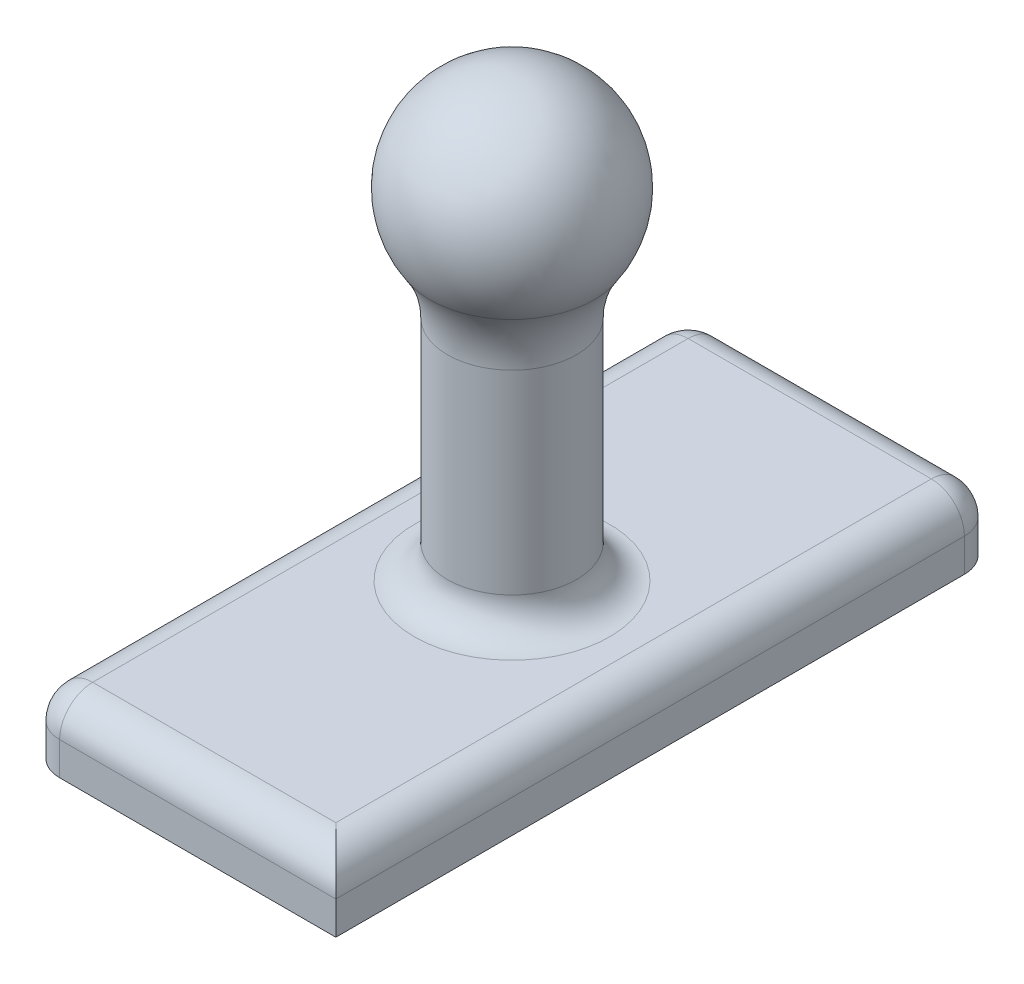
ISO-10303-21;
HEADER;
FILE_DESCRIPTION(('STEP AP214'),'2;1');
FILE_NAME('part.step','',(''),(''),'','','');
FILE_SCHEMA(('AUTOMOTIVE_DESIGN { 1 0 10303 214 1 1 1 1 }'));
ENDSEC;
DATA;
#1=APPLICATION_CONTEXT('core data for automotive mechanical design processes');
#2=APPLICATION_PROTOCOL_DEFINITION('international standard','automotive_design',2000,#1);
#3=PRODUCT_CONTEXT('',#1,'mechanical');
#4=PRODUCT('Part','Part','',(#3));
#5=PRODUCT_RELATED_PRODUCT_CATEGORY('part','',(#4));
#6=PRODUCT_DEFINITION_FORMATION('','',#4);
#7=PRODUCT_DEFINITION_CONTEXT('part definition',#1,'design');
#8=PRODUCT_DEFINITION('design','',#6,#7);
#9=PRODUCT_DEFINITION_SHAPE('','',#8);
#10=(LENGTH_UNIT() NAMED_UNIT(*) SI_UNIT(.MILLI.,.METRE.));
#11=(NAMED_UNIT(*) PLANE_ANGLE_UNIT() SI_UNIT($,.RADIAN.));
#12=(NAMED_UNIT(*) SI_UNIT($,.STERADIAN.) SOLID_ANGLE_UNIT());
#13=UNCERTAINTY_MEASURE_WITH_UNIT(LENGTH_MEASURE(1.E-05),#10,'distance_accuracy_value','');
#14=(GEOMETRIC_REPRESENTATION_CONTEXT(3) GLOBAL_UNCERTAINTY_ASSIGNED_CONTEXT((#13)) GLOBAL_UNIT_ASSIGNED_CONTEXT((#10,
#11,#12)) REPRESENTATION_CONTEXT('',''));
#15=CARTESIAN_POINT('',(0.,0.,0.));
#16=DIRECTION('',(0.,0.,1.));
#17=DIRECTION('',(1.,0.,0.));
#18=AXIS2_PLACEMENT_3D('',#15,#16,#17);
#19=CARTESIAN_POINT('',(0.,8.,0.));
#20=DIRECTION('',(0.,-1.,0.));
#21=DIRECTION('',(0.,0.,-1.));
#22=AXIS2_PLACEMENT_3D('',#19,#20,#21);
#23=CYLINDRICAL_SURFACE('',#22,1.95);
#24=CARTESIAN_POINT('',(0.,6.88505968506724,0.));
#25=DIRECTION('',(0.,1.,0.));
#26=DIRECTION('',(0.,0.,1.));
#27=AXIS2_PLACEMENT_3D('',#24,#25,#26);
#28=CIRCLE('',#27,1.95);
#29=CARTESIAN_POINT('',(0.,6.88505968506724,1.95));
#30=VERTEX_POINT('',#29);
#31=EDGE_CURVE('E11',#30,#30,#28,.F.);
#32=ORIENTED_EDGE('',*,*,#31,.T.);
#33=EDGE_LOOP('',(#32));
#34=FACE_BOUND('',#33,.T.);
#35=CARTESIAN_POINT('',(0.,1.,0.));
#36=DIRECTION('',(0.,1.,0.));
#37=DIRECTION('',(0.,0.,1.));
#38=AXIS2_PLACEMENT_3D('',#35,#36,#37);
#39=CIRCLE('',#38,1.95);
#40=CARTESIAN_POINT('',(0.,1.,1.95));
#41=VERTEX_POINT('',#40);
#42=EDGE_CURVE('E162',#41,#41,#39,.T.);
#43=ORIENTED_EDGE('',*,*,#42,.T.);
#44=EDGE_LOOP('',(#43));
#45=FACE_BOUND('',#44,.T.);
#46=ADVANCED_FACE('F43',(#34,#45),#23,.T.);
#47=CARTESIAN_POINT('',(0.,10.2912735849057,0.));
#48=DIRECTION('',(0.,0.,1.));
#49=DIRECTION('',(1.,0.,0.));
#50=AXIS2_PLACEMENT_3D('',#47,#48,#49);
#51=SPHERICAL_SURFACE('',#50,3.00872641509434);
#52=CARTESIAN_POINT('',(0.,10.2912735849057,0.));
#53=DIRECTION('',(0.,1.,0.));
#54=DIRECTION('',(0.,0.,1.));
#55=AXIS2_PLACEMENT_3D('',#52,#53,#54);
#56=SPHERICAL_SURFACE('',#55,3.00872641509434);
#57=CARTESIAN_POINT('',(0.,8.58569322928142,0.));
#58=DIRECTION('',(0.,1.,0.));
#59=DIRECTION('',(0.,0.,1.));
#60=AXIS2_PLACEMENT_3D('',#57,#58,#59);
#61=CIRCLE('',#60,2.47859441849511);
#62=CARTESIAN_POINT('',(0.,8.58569322928142,2.47859441849511));
#63=VERTEX_POINT('',#62);
#64=EDGE_CURVE('E51',#63,#63,#61,.T.);
#65=ORIENTED_EDGE('',*,*,#64,.T.);
#66=EDGE_LOOP('',(#65));
#67=FACE_BOUND('',#66,.T.);
#68=ADVANCED_FACE('F206',(#67),#56,.T.);
#69=CARTESIAN_POINT('',(-4.675,-2.,-10.));
#70=DIRECTION('',(-1.,0.,0.));
#71=DIRECTION('',(0.,0.,1.));
#72=AXIS2_PLACEMENT_3D('',#69,#70,#71);
#73=PLANE('',#72);
#74=DIRECTION('',(0.,0.,1.));
#75=VECTOR('',#74,1.);
#76=CARTESIAN_POINT('',(-4.675,-2.,-10.));
#77=LINE('',#76,#75);
#78=CARTESIAN_POINT('',(-4.675,-2.,-9.));
#79=VERTEX_POINT('',#78);
#80=CARTESIAN_POINT('',(-4.675,-2.,9.));
#81=VERTEX_POINT('',#80);
#82=EDGE_CURVE('E135',#79,#81,#77,.T.);
#83=ORIENTED_EDGE('',*,*,#82,.T.);
#84=DIRECTION('',(0.,1.,0.));
#85=VECTOR('',#84,1.);
#86=CARTESIAN_POINT('',(-4.675,-2.,9.));
#87=LINE('',#86,#85);
#88=CARTESIAN_POINT('',(-4.675,-1.,9.));
#89=VERTEX_POINT('',#88);
#90=EDGE_CURVE('E187',#81,#89,#87,.T.);
#91=ORIENTED_EDGE('',*,*,#90,.T.);
#92=DIRECTION('',(0.,0.,1.));
#93=VECTOR('',#92,1.);
#94=CARTESIAN_POINT('',(-4.675,-1.,-10.));
#95=LINE('',#94,#93);
#96=CARTESIAN_POINT('',(-4.675,-1.,-9.));
#97=VERTEX_POINT('',#96);
#98=EDGE_CURVE('E156',#89,#97,#95,.F.);
#99=ORIENTED_EDGE('',*,*,#98,.T.);
#100=DIRECTION('',(0.,1.,0.));
#101=VECTOR('',#100,1.);
#102=CARTESIAN_POINT('',(-4.675,-2.,-9.));
#103=LINE('',#102,#101);
#104=EDGE_CURVE('E183',#97,#79,#103,.F.);
#105=ORIENTED_EDGE('',*,*,#104,.T.);
#106=EDGE_LOOP('',(#83,#91,#99,#105));
#107=FACE_BOUND('',#106,.T.);
#108=ADVANCED_FACE('F228',(#107),#73,.T.);
#109=CARTESIAN_POINT('',(-4.675,-2.,-10.));
#110=DIRECTION('',(0.,0.,1.));
#111=DIRECTION('',(1.,0.,0.));
#112=AXIS2_PLACEMENT_3D('',#109,#110,#111);
#113=PLANE('',#112);
#114=DIRECTION('',(1.,0.,0.));
#115=VECTOR('',#114,1.);
#116=CARTESIAN_POINT('',(4.675,-1.,-10.));
#117=LINE('',#116,#115);
#118=CARTESIAN_POINT('',(-3.675,-1.,-10.));
#119=VERTEX_POINT('',#118);
#120=CARTESIAN_POINT('',(3.675,-1.,-10.));
#121=VERTEX_POINT('',#120);
#122=EDGE_CURVE('E140',#119,#121,#117,.T.);
#123=ORIENTED_EDGE('',*,*,#122,.T.);
#124=DIRECTION('',(0.,1.,0.));
#125=VECTOR('',#124,1.);
#126=CARTESIAN_POINT('',(3.675,-2.,-10.));
#127=LINE('',#126,#125);
#128=CARTESIAN_POINT('',(3.675,-2.,-10.));
#129=VERTEX_POINT('',#128);
#130=EDGE_CURVE('E67',#121,#129,#127,.F.);
#131=ORIENTED_EDGE('',*,*,#130,.T.);
#132=DIRECTION('',(1.,0.,0.));
#133=VECTOR('',#132,1.);
#134=CARTESIAN_POINT('',(-4.675,-2.,-10.));
#135=LINE('',#134,#133);
#136=CARTESIAN_POINT('',(-3.675,-2.,-10.));
#137=VERTEX_POINT('',#136);
#138=EDGE_CURVE('E125',#137,#129,#135,.T.);
#139=ORIENTED_EDGE('',*,*,#138,.F.);
#140=DIRECTION('',(0.,1.,0.));
#141=VECTOR('',#140,1.);
#142=CARTESIAN_POINT('',(-3.675,-1.,-10.));
#143=LINE('',#142,#141);
#144=EDGE_CURVE('E197',#137,#119,#143,.T.);
#145=ORIENTED_EDGE('',*,*,#144,.T.);
#146=EDGE_LOOP('',(#123,#131,#139,#145));
#147=FACE_BOUND('',#146,.T.);
#148=ADVANCED_FACE('F277',(#147),#113,.F.);
#149=CARTESIAN_POINT('',(4.675,-2.,-10.));
#150=DIRECTION('',(-1.,0.,0.));
#151=DIRECTION('',(0.,0.,1.));
#152=AXIS2_PLACEMENT_3D('',#149,#150,#151);
#153=PLANE('',#152);
#154=DIRECTION('',(0.,0.,1.));
#155=VECTOR('',#154,1.);
#156=CARTESIAN_POINT('',(4.675,-2.,-10.));
#157=LINE('',#156,#155);
#158=CARTESIAN_POINT('',(4.675,-2.,-9.));
#159=VERTEX_POINT('',#158);
#160=CARTESIAN_POINT('',(4.675,-2.,10.));
#161=VERTEX_POINT('',#160);
#162=EDGE_CURVE('E112',#159,#161,#157,.T.);
#163=ORIENTED_EDGE('',*,*,#162,.F.);
#164=DIRECTION('',(0.,1.,0.));
#165=VECTOR('',#164,1.);
#166=CARTESIAN_POINT('',(4.675,-2.,-9.));
#167=LINE('',#166,#165);
#168=CARTESIAN_POINT('',(4.675,-1.,-9.));
#169=VERTEX_POINT('',#168);
#170=EDGE_CURVE('E193',#159,#169,#167,.T.);
#171=ORIENTED_EDGE('',*,*,#170,.T.);
#172=DIRECTION('',(0.,0.,1.));
#173=VECTOR('',#172,1.);
#174=CARTESIAN_POINT('',(4.675,-1.,10.));
#175=LINE('',#174,#173);
#176=CARTESIAN_POINT('',(4.675,-1.,10.));
#177=VERTEX_POINT('',#176);
#178=EDGE_CURVE('E137',#169,#177,#175,.T.);
#179=ORIENTED_EDGE('',*,*,#178,.T.);
#180=DIRECTION('',(0.,1.,0.));
#181=VECTOR('',#180,1.);
#182=CARTESIAN_POINT('',(4.675,-2.,10.));
#183=LINE('',#182,#181);
#184=EDGE_CURVE('E127',#161,#177,#183,.T.);
#185=ORIENTED_EDGE('',*,*,#184,.F.);
#186=EDGE_LOOP('',(#163,#171,#179,#185));
#187=FACE_BOUND('',#186,.T.);
#188=ADVANCED_FACE('F134',(#187),#153,.F.);
#189=CARTESIAN_POINT('',(-4.675,-2.,10.));
#190=DIRECTION('',(0.,0.,1.));
#191=DIRECTION('',(1.,0.,0.));
#192=AXIS2_PLACEMENT_3D('',#189,#190,#191);
#193=PLANE('',#192);
#194=DIRECTION('',(1.,0.,0.));
#195=VECTOR('',#194,1.);
#196=CARTESIAN_POINT('',(-4.675,-1.,10.));
#197=LINE('',#196,#195);
#198=CARTESIAN_POINT('',(-3.675,-1.,10.));
#199=VERTEX_POINT('',#198);
#200=EDGE_CURVE('E160',#177,#199,#197,.F.);
#201=ORIENTED_EDGE('',*,*,#200,.T.);
#202=DIRECTION('',(0.,1.,0.));
#203=VECTOR('',#202,1.);
#204=CARTESIAN_POINT('',(-3.675,-2.,10.));
#205=LINE('',#204,#203);
#206=CARTESIAN_POINT('',(-3.675,-2.,10.));
#207=VERTEX_POINT('',#206);
#208=EDGE_CURVE('E132',#199,#207,#205,.F.);
#209=ORIENTED_EDGE('',*,*,#208,.T.);
#210=DIRECTION('',(1.,0.,0.));
#211=VECTOR('',#210,1.);
#212=CARTESIAN_POINT('',(-4.675,-2.,10.));
#213=LINE('',#212,#211);
#214=EDGE_CURVE('E120',#207,#161,#213,.T.);
#215=ORIENTED_EDGE('',*,*,#214,.T.);
#216=ORIENTED_EDGE('',*,*,#184,.T.);
#217=EDGE_LOOP('',(#201,#209,#215,#216));
#218=FACE_BOUND('',#217,.T.);
#219=ADVANCED_FACE('F130',(#218),#193,.T.);
#220=CARTESIAN_POINT('',(0.,-2.,0.));
#221=DIRECTION('',(0.,1.,0.));
#222=DIRECTION('',(0.,0.,1.));
#223=AXIS2_PLACEMENT_3D('',#220,#221,#222);
#224=PLANE('',#223);
#225=ORIENTED_EDGE('',*,*,#214,.F.);
#226=CARTESIAN_POINT('',(-3.675,-2.,9.));
#227=DIRECTION('',(0.,1.,0.));
#228=DIRECTION('',(0.,0.,1.));
#229=AXIS2_PLACEMENT_3D('',#226,#227,#228);
#230=CIRCLE('',#229,1.);
#231=EDGE_CURVE('E195',#207,#81,#230,.F.);
#232=ORIENTED_EDGE('',*,*,#231,.T.);
#233=ORIENTED_EDGE('',*,*,#82,.F.);
#234=CARTESIAN_POINT('',(-3.675,-2.,-9.));
#235=DIRECTION('',(0.,1.,0.));
#236=DIRECTION('',(0.,0.,1.));
#237=AXIS2_PLACEMENT_3D('',#234,#235,#236);
#238=CIRCLE('',#237,1.);
#239=EDGE_CURVE('E186',#79,#137,#238,.F.);
#240=ORIENTED_EDGE('',*,*,#239,.T.);
#241=ORIENTED_EDGE('',*,*,#138,.T.);
#242=CARTESIAN_POINT('',(3.675,-2.,-9.));
#243=DIRECTION('',(0.,1.,0.));
#244=DIRECTION('',(0.,0.,1.));
#245=AXIS2_PLACEMENT_3D('',#242,#243,#244);
#246=CIRCLE('',#245,1.);
#247=EDGE_CURVE('E59',#129,#159,#246,.F.);
#248=ORIENTED_EDGE('',*,*,#247,.T.);
#249=ORIENTED_EDGE('',*,*,#162,.T.);
#250=EDGE_LOOP('',(#225,#232,#233,#240,#241,#248,#249));
#251=FACE_BOUND('',#250,.T.);
#252=ADVANCED_FACE('F116',(#251),#224,.F.);
#253=CARTESIAN_POINT('',(0.,0.,0.));
#254=DIRECTION('',(0.,1.,0.));
#255=DIRECTION('',(0.,0.,1.));
#256=AXIS2_PLACEMENT_3D('',#253,#254,#255);
#257=PLANE('',#256);
#258=DIRECTION('',(0.,0.,1.));
#259=VECTOR('',#258,1.);
#260=CARTESIAN_POINT('',(3.675,0.,-10.));
#261=LINE('',#260,#259);
#262=CARTESIAN_POINT('',(3.675,0.,9.));
#263=VERTEX_POINT('',#262);
#264=CARTESIAN_POINT('',(3.675,0.,-9.));
#265=VERTEX_POINT('',#264);
#266=EDGE_CURVE('E149',#263,#265,#261,.F.);
#267=ORIENTED_EDGE('',*,*,#266,.T.);
#268=DIRECTION('',(1.,0.,0.));
#269=VECTOR('',#268,1.);
#270=CARTESIAN_POINT('',(-4.675,0.,-9.));
#271=LINE('',#270,#269);
#272=CARTESIAN_POINT('',(-3.675,0.,-9.));
#273=VERTEX_POINT('',#272);
#274=EDGE_CURVE('E153',#265,#273,#271,.F.);
#275=ORIENTED_EDGE('',*,*,#274,.T.);
#276=DIRECTION('',(0.,0.,1.));
#277=VECTOR('',#276,1.);
#278=CARTESIAN_POINT('',(-3.675,0.,0.));
#279=LINE('',#278,#277);
#280=CARTESIAN_POINT('',(-3.675,0.,9.));
#281=VERTEX_POINT('',#280);
#282=EDGE_CURVE('E143',#273,#281,#279,.T.);
#283=ORIENTED_EDGE('',*,*,#282,.T.);
#284=DIRECTION('',(1.,0.,0.));
#285=VECTOR('',#284,1.);
#286=CARTESIAN_POINT('',(0.,0.,9.));
#287=LINE('',#286,#285);
#288=EDGE_CURVE('E147',#281,#263,#287,.T.);
#289=ORIENTED_EDGE('',*,*,#288,.T.);
#290=EDGE_LOOP('',(#267,#275,#283,#289));
#291=FACE_BOUND('',#290,.T.);
#292=CARTESIAN_POINT('',(0.,0.,0.));
#293=DIRECTION('',(0.,1.,0.));
#294=DIRECTION('',(0.,0.,1.));
#295=AXIS2_PLACEMENT_3D('',#292,#293,#294);
#296=CIRCLE('',#295,2.95);
#297=CARTESIAN_POINT('',(0.,0.,2.95));
#298=VERTEX_POINT('',#297);
#299=EDGE_CURVE('E136',#298,#298,#296,.F.);
#300=ORIENTED_EDGE('',*,*,#299,.T.);
#301=EDGE_LOOP('',(#300));
#302=FACE_BOUND('',#301,.T.);
#303=ADVANCED_FACE('F247',(#291,#302),#257,.T.);
#304=CARTESIAN_POINT('',(0.,-1.,9.));
#305=DIRECTION('',(1.,0.,0.));
#306=DIRECTION('',(0.,0.,-1.));
#307=AXIS2_PLACEMENT_3D('',#304,#305,#306);
#308=CYLINDRICAL_SURFACE('',#307,1.);
#309=ORIENTED_EDGE('',*,*,#288,.F.);
#310=CARTESIAN_POINT('',(-3.675,-1.,9.));
#311=DIRECTION('',(1.,0.,0.));
#312=DIRECTION('',(0.,0.,-1.));
#313=AXIS2_PLACEMENT_3D('',#310,#311,#312);
#314=CIRCLE('',#313,1.);
#315=EDGE_CURVE('E172',#281,#199,#314,.T.);
#316=ORIENTED_EDGE('',*,*,#315,.T.);
#317=ORIENTED_EDGE('',*,*,#200,.F.);
#318=CARTESIAN_POINT('',(3.675,-1.,9.));
#319=DIRECTION('',(0.707106781186547,0.,-0.707106781186547));
#320=DIRECTION('',(0.707106781186547,0.,0.707106781186547));
#321=AXIS2_PLACEMENT_3D('',#318,#319,#320);
#322=ELLIPSE('',#321,1.41421356237309,1.);
#323=EDGE_CURVE('E168',#263,#177,#322,.T.);
#324=ORIENTED_EDGE('',*,*,#323,.F.);
#325=EDGE_LOOP('',(#309,#316,#317,#324));
#326=FACE_BOUND('',#325,.T.);
#327=ADVANCED_FACE('F242',(#326),#308,.T.);
#328=CARTESIAN_POINT('',(-3.675,-1.,0.));
#329=DIRECTION('',(0.,0.,1.));
#330=DIRECTION('',(1.,0.,0.));
#331=AXIS2_PLACEMENT_3D('',#328,#329,#330);
#332=CYLINDRICAL_SURFACE('',#331,1.);
#333=ORIENTED_EDGE('',*,*,#98,.F.);
#334=CARTESIAN_POINT('',(-3.675,-1.,9.));
#335=DIRECTION('',(0.,0.,1.));
#336=DIRECTION('',(1.,0.,0.));
#337=AXIS2_PLACEMENT_3D('',#334,#335,#336);
#338=CIRCLE('',#337,1.);
#339=EDGE_CURVE('E171',#89,#281,#338,.F.);
#340=ORIENTED_EDGE('',*,*,#339,.T.);
#341=ORIENTED_EDGE('',*,*,#282,.F.);
#342=CARTESIAN_POINT('',(-3.675,-1.,-9.));
#343=DIRECTION('',(0.,0.,1.));
#344=DIRECTION('',(1.,0.,0.));
#345=AXIS2_PLACEMENT_3D('',#342,#343,#344);
#346=CIRCLE('',#345,1.);
#347=EDGE_CURVE('E164',#273,#97,#346,.T.);
#348=ORIENTED_EDGE('',*,*,#347,.T.);
#349=EDGE_LOOP('',(#333,#340,#341,#348));
#350=FACE_BOUND('',#349,.T.);
#351=ADVANCED_FACE('F239',(#350),#332,.T.);
#352=CARTESIAN_POINT('',(3.675,-1.,-10.));
#353=DIRECTION('',(0.,0.,-1.));
#354=DIRECTION('',(-1.,0.,0.));
#355=AXIS2_PLACEMENT_3D('',#352,#353,#354);
#356=CYLINDRICAL_SURFACE('',#355,1.);
#357=ORIENTED_EDGE('',*,*,#178,.F.);
#358=CARTESIAN_POINT('',(3.675,-1.,-9.));
#359=DIRECTION('',(0.,0.,-1.));
#360=DIRECTION('',(-1.,0.,0.));
#361=AXIS2_PLACEMENT_3D('',#358,#359,#360);
#362=CIRCLE('',#361,1.);
#363=EDGE_CURVE('E185',#169,#265,#362,.F.);
#364=ORIENTED_EDGE('',*,*,#363,.T.);
#365=ORIENTED_EDGE('',*,*,#266,.F.);
#366=ORIENTED_EDGE('',*,*,#323,.T.);
#367=EDGE_LOOP('',(#357,#364,#365,#366));
#368=FACE_BOUND('',#367,.T.);
#369=ADVANCED_FACE('F236',(#368),#356,.T.);
#370=CARTESIAN_POINT('',(-4.675,-1.,-9.));
#371=DIRECTION('',(-1.,0.,0.));
#372=DIRECTION('',(0.,0.,1.));
#373=AXIS2_PLACEMENT_3D('',#370,#371,#372);
#374=CYLINDRICAL_SURFACE('',#373,1.);
#375=ORIENTED_EDGE('',*,*,#274,.F.);
#376=CARTESIAN_POINT('',(3.675,-1.,-9.));
#377=DIRECTION('',(-1.,0.,0.));
#378=DIRECTION('',(0.,0.,1.));
#379=AXIS2_PLACEMENT_3D('',#376,#377,#378);
#380=CIRCLE('',#379,1.);
#381=EDGE_CURVE('E177',#265,#121,#380,.T.);
#382=ORIENTED_EDGE('',*,*,#381,.T.);
#383=ORIENTED_EDGE('',*,*,#122,.F.);
#384=CARTESIAN_POINT('',(-3.675,-1.,-9.));
#385=DIRECTION('',(-1.,0.,0.));
#386=DIRECTION('',(0.,0.,1.));
#387=AXIS2_PLACEMENT_3D('',#384,#385,#386);
#388=CIRCLE('',#387,1.);
#389=EDGE_CURVE('E176',#119,#273,#388,.F.);
#390=ORIENTED_EDGE('',*,*,#389,.T.);
#391=EDGE_LOOP('',(#375,#382,#383,#390));
#392=FACE_BOUND('',#391,.T.);
#393=ADVANCED_FACE('F235',(#392),#374,.T.);
#394=CARTESIAN_POINT('',(0.,1.,0.));
#395=DIRECTION('',(0.,1.,0.));
#396=DIRECTION('',(0.,0.,1.));
#397=AXIS2_PLACEMENT_3D('',#394,#395,#396);
#398=TOROIDAL_SURFACE('',#397,2.95,1.);
#399=ORIENTED_EDGE('',*,*,#299,.F.);
#400=EDGE_LOOP('',(#399));
#401=FACE_BOUND('',#400,.T.);
#402=ORIENTED_EDGE('',*,*,#42,.F.);
#403=EDGE_LOOP('',(#402));
#404=FACE_BOUND('',#403,.T.);
#405=ADVANCED_FACE('F232',(#401,#404),#398,.F.);
#406=CARTESIAN_POINT('',(-3.675,-2.,9.));
#407=DIRECTION('',(0.,1.,0.));
#408=DIRECTION('',(0.,0.,1.));
#409=AXIS2_PLACEMENT_3D('',#406,#407,#408);
#410=CYLINDRICAL_SURFACE('',#409,1.);
#411=ORIENTED_EDGE('',*,*,#231,.F.);
#412=ORIENTED_EDGE('',*,*,#208,.F.);
#413=CARTESIAN_POINT('',(-3.675,-1.,9.));
#414=DIRECTION('',(0.,1.,0.));
#415=DIRECTION('',(0.,0.,1.));
#416=AXIS2_PLACEMENT_3D('',#413,#414,#415);
#417=CIRCLE('',#416,1.);
#418=EDGE_CURVE('E169',#89,#199,#417,.T.);
#419=ORIENTED_EDGE('',*,*,#418,.F.);
#420=ORIENTED_EDGE('',*,*,#90,.F.);
#421=EDGE_LOOP('',(#411,#412,#419,#420));
#422=FACE_BOUND('',#421,.T.);
#423=ADVANCED_FACE('F255',(#422),#410,.T.);
#424=CARTESIAN_POINT('',(-3.675,-1.,9.));
#425=DIRECTION('',(0.,0.,1.));
#426=DIRECTION('',(1.,0.,0.));
#427=AXIS2_PLACEMENT_3D('',#424,#425,#426);
#428=SPHERICAL_SURFACE('',#427,1.);
#429=ORIENTED_EDGE('',*,*,#418,.T.);
#430=ORIENTED_EDGE('',*,*,#315,.F.);
#431=ORIENTED_EDGE('',*,*,#339,.F.);
#432=EDGE_LOOP('',(#429,#430,#431));
#433=FACE_BOUND('',#432,.T.);
#434=ADVANCED_FACE('F251',(#433),#428,.T.);
#435=CARTESIAN_POINT('',(3.675,-2.,-9.));
#436=DIRECTION('',(0.,1.,0.));
#437=DIRECTION('',(0.,0.,1.));
#438=AXIS2_PLACEMENT_3D('',#435,#436,#437);
#439=CYLINDRICAL_SURFACE('',#438,1.);
#440=ORIENTED_EDGE('',*,*,#247,.F.);
#441=ORIENTED_EDGE('',*,*,#130,.F.);
#442=CARTESIAN_POINT('',(3.675,-1.,-9.));
#443=DIRECTION('',(0.,1.,0.));
#444=DIRECTION('',(0.,0.,1.));
#445=AXIS2_PLACEMENT_3D('',#442,#443,#444);
#446=CIRCLE('',#445,1.);
#447=EDGE_CURVE('E202',#169,#121,#446,.T.);
#448=ORIENTED_EDGE('',*,*,#447,.F.);
#449=ORIENTED_EDGE('',*,*,#170,.F.);
#450=EDGE_LOOP('',(#440,#441,#448,#449));
#451=FACE_BOUND('',#450,.T.);
#452=ADVANCED_FACE('F260',(#451),#439,.T.);
#453=CARTESIAN_POINT('',(3.675,-1.,-9.));
#454=DIRECTION('',(0.,0.,1.));
#455=DIRECTION('',(1.,0.,0.));
#456=AXIS2_PLACEMENT_3D('',#453,#454,#455);
#457=SPHERICAL_SURFACE('',#456,1.);
#458=ORIENTED_EDGE('',*,*,#381,.F.);
#459=ORIENTED_EDGE('',*,*,#363,.F.);
#460=ORIENTED_EDGE('',*,*,#447,.T.);
#461=EDGE_LOOP('',(#458,#459,#460));
#462=FACE_BOUND('',#461,.T.);
#463=ADVANCED_FACE('F265',(#462),#457,.T.);
#464=CARTESIAN_POINT('',(-3.675,-2.,-9.));
#465=DIRECTION('',(0.,-1.,0.));
#466=DIRECTION('',(0.,0.,-1.));
#467=AXIS2_PLACEMENT_3D('',#464,#465,#466);
#468=CYLINDRICAL_SURFACE('',#467,1.);
#469=ORIENTED_EDGE('',*,*,#239,.F.);
#470=ORIENTED_EDGE('',*,*,#104,.F.);
#471=CARTESIAN_POINT('',(-3.675,-1.,-9.));
#472=DIRECTION('',(0.,1.,0.));
#473=DIRECTION('',(0.,0.,1.));
#474=AXIS2_PLACEMENT_3D('',#471,#472,#473);
#475=CIRCLE('',#474,1.);
#476=EDGE_CURVE('E204',#119,#97,#475,.T.);
#477=ORIENTED_EDGE('',*,*,#476,.F.);
#478=ORIENTED_EDGE('',*,*,#144,.F.);
#479=EDGE_LOOP('',(#469,#470,#477,#478));
#480=FACE_BOUND('',#479,.T.);
#481=ADVANCED_FACE('F220',(#480),#468,.T.);
#482=CARTESIAN_POINT('',(-3.675,-1.,-9.));
#483=DIRECTION('',(0.,0.,1.));
#484=DIRECTION('',(1.,0.,0.));
#485=AXIS2_PLACEMENT_3D('',#482,#483,#484);
#486=SPHERICAL_SURFACE('',#485,1.);
#487=ORIENTED_EDGE('',*,*,#476,.T.);
#488=ORIENTED_EDGE('',*,*,#347,.F.);
#489=ORIENTED_EDGE('',*,*,#389,.F.);
#490=EDGE_LOOP('',(#487,#488,#489));
#491=FACE_BOUND('',#490,.T.);
#492=ADVANCED_FACE('F211',(#491),#486,.T.);
#493=CARTESIAN_POINT('',(0.,6.88505968506724,0.));
#494=DIRECTION('',(0.,1.,0.));
#495=DIRECTION('',(0.,0.,1.));
#496=AXIS2_PLACEMENT_3D('',#493,#494,#495);
#497=TOROIDAL_SURFACE('',#496,4.95,3.);
#498=ORIENTED_EDGE('',*,*,#31,.F.);
#499=EDGE_LOOP('',(#498));
#500=FACE_BOUND('',#499,.T.);
#501=ORIENTED_EDGE('',*,*,#64,.F.);
#502=EDGE_LOOP('',(#501));
#503=FACE_BOUND('',#502,.T.);
#504=ADVANCED_FACE('F44',(#500,#503),#497,.F.);
#505=CLOSED_SHELL('',(#46,#68,#108,#148,#188,#219,#252,#303,#327,#351,#369,#393,#405,#423,#434,
#452,#463,#481,#492,#504));
#506=MANIFOLD_SOLID_BREP('B2',#505);
#507=ADVANCED_BREP_SHAPE_REPRESENTATION('',(#18,#506),#14);
#508=SHAPE_DEFINITION_REPRESENTATION(#9,#507);
ENDSEC;
END-ISO-10303-21;
